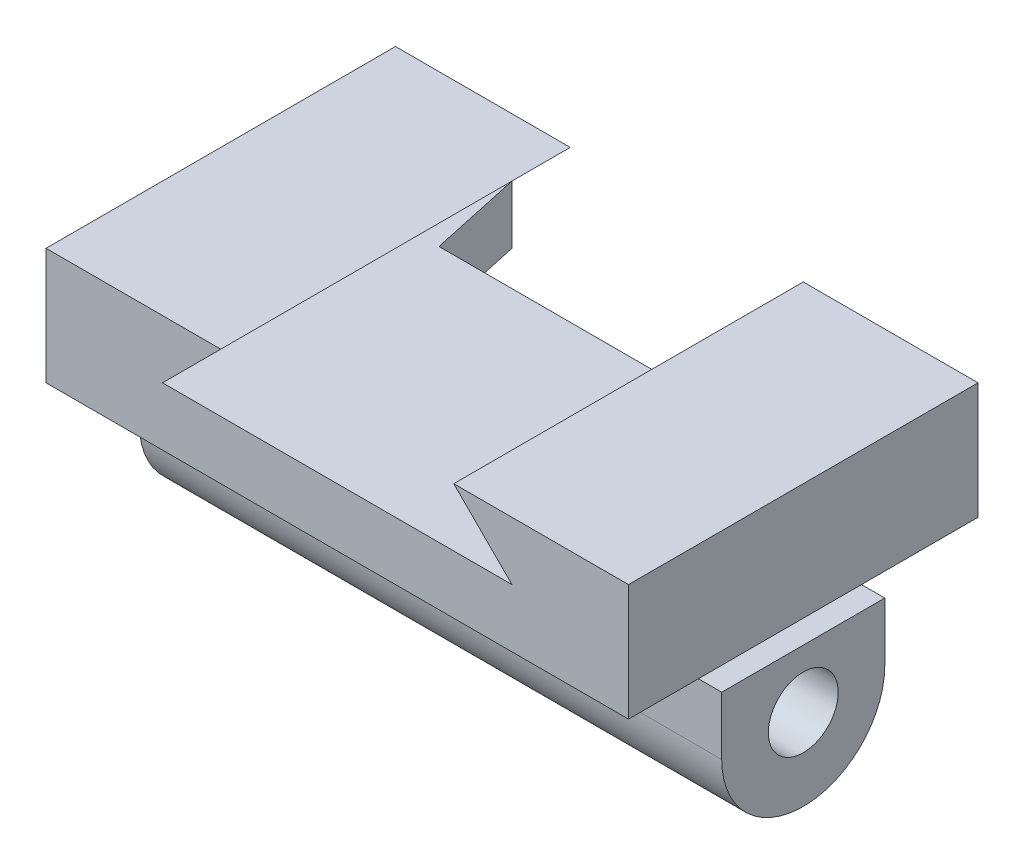
ISO-10303-21;
HEADER;
FILE_DESCRIPTION(('STEP AP214'),'2;1');
FILE_NAME('part.step','',(''),(''),'','','');
FILE_SCHEMA(('AUTOMOTIVE_DESIGN { 1 0 10303 214 1 1 1 1 }'));
ENDSEC;
DATA;
#1=APPLICATION_CONTEXT('core data for automotive mechanical design processes');
#2=APPLICATION_PROTOCOL_DEFINITION('international standard','automotive_design',2000,#1);
#3=PRODUCT_CONTEXT('',#1,'mechanical');
#4=PRODUCT('Part','Part','',(#3));
#5=PRODUCT_RELATED_PRODUCT_CATEGORY('part','',(#4));
#6=PRODUCT_DEFINITION_FORMATION('','',#4);
#7=PRODUCT_DEFINITION_CONTEXT('part definition',#1,'design');
#8=PRODUCT_DEFINITION('design','',#6,#7);
#9=PRODUCT_DEFINITION_SHAPE('','',#8);
#10=(LENGTH_UNIT() NAMED_UNIT(*) SI_UNIT(.MILLI.,.METRE.));
#11=(NAMED_UNIT(*) PLANE_ANGLE_UNIT() SI_UNIT($,.RADIAN.));
#12=(NAMED_UNIT(*) SI_UNIT($,.STERADIAN.) SOLID_ANGLE_UNIT());
#13=UNCERTAINTY_MEASURE_WITH_UNIT(LENGTH_MEASURE(1.E-05),#10,'distance_accuracy_value','');
#14=(GEOMETRIC_REPRESENTATION_CONTEXT(3) GLOBAL_UNCERTAINTY_ASSIGNED_CONTEXT((#13)) GLOBAL_UNIT_ASSIGNED_CONTEXT((#10,
#11,#12)) REPRESENTATION_CONTEXT('',''));
#15=CARTESIAN_POINT('',(0.,0.,0.));
#16=DIRECTION('',(0.,0.,1.));
#17=DIRECTION('',(1.,0.,0.));
#18=AXIS2_PLACEMENT_3D('',#15,#16,#17);
#19=CARTESIAN_POINT('',(0.,5.,0.));
#20=DIRECTION('',(0.,1.,0.));
#21=DIRECTION('',(0.,0.,1.));
#22=AXIS2_PLACEMENT_3D('',#19,#20,#21);
#23=PLANE('',#22);
#24=DIRECTION('',(1.,0.,0.));
#25=VECTOR('',#24,1.);
#26=CARTESIAN_POINT('',(0.,5.,15.));
#27=LINE('',#26,#25);
#28=CARTESIAN_POINT('',(-15.,5.,15.));
#29=VERTEX_POINT('',#28);
#30=CARTESIAN_POINT('',(15.,5.,15.));
#31=VERTEX_POINT('',#30);
#32=EDGE_CURVE('E53',#29,#31,#27,.T.);
#33=ORIENTED_EDGE('',*,*,#32,.T.);
#34=DIRECTION('',(0.,0.,1.));
#35=VECTOR('',#34,1.);
#36=CARTESIAN_POINT('',(15.,5.,-15.));
#37=LINE('',#36,#35);
#38=CARTESIAN_POINT('',(15.,5.,-15.));
#39=VERTEX_POINT('',#38);
#40=EDGE_CURVE('E222',#39,#31,#37,.T.);
#41=ORIENTED_EDGE('',*,*,#40,.F.);
#42=DIRECTION('',(-0.211772892657066,0.,0.977318904931066));
#43=VECTOR('',#42,1.);
#44=CARTESIAN_POINT('',(11.2227388558496,5.,2.4318284022202));
#45=LINE('',#44,#43);
#46=CARTESIAN_POINT('',(13.2664991614216,5.,-7.));
#47=VERTEX_POINT('',#46);
#48=EDGE_CURVE('E274',#39,#47,#45,.T.);
#49=ORIENTED_EDGE('',*,*,#48,.T.);
#50=DIRECTION('',(1.,0.,0.));
#51=VECTOR('',#50,1.);
#52=CARTESIAN_POINT('',(0.,5.,-7.));
#53=LINE('',#52,#51);
#54=CARTESIAN_POINT('',(-13.2664991614216,5.,-7.));
#55=VERTEX_POINT('',#54);
#56=EDGE_CURVE('E277',#55,#47,#53,.T.);
#57=ORIENTED_EDGE('',*,*,#56,.F.);
#58=DIRECTION('',(0.211772892657066,0.,0.977318904931066));
#59=VECTOR('',#58,1.);
#60=CARTESIAN_POINT('',(-11.2227388558496,5.,2.4318284022202));
#61=LINE('',#60,#59);
#62=CARTESIAN_POINT('',(-15.,5.,-15.));
#63=VERTEX_POINT('',#62);
#64=EDGE_CURVE('E280',#63,#55,#61,.T.);
#65=ORIENTED_EDGE('',*,*,#64,.F.);
#66=DIRECTION('',(0.,0.,1.));
#67=VECTOR('',#66,1.);
#68=CARTESIAN_POINT('',(-15.,5.,-15.));
#69=LINE('',#68,#67);
#70=EDGE_CURVE('E240',#63,#29,#69,.T.);
#71=ORIENTED_EDGE('',*,*,#70,.T.);
#72=EDGE_LOOP('',(#33,#41,#49,#57,#65,#71));
#73=FACE_BOUND('',#72,.T.);
#74=ADVANCED_FACE('F38',(#73),#23,.T.);
#75=CARTESIAN_POINT('',(0.,5.,15.));
#76=DIRECTION('',(0.,0.,-1.));
#77=DIRECTION('',(-1.,0.,0.));
#78=AXIS2_PLACEMENT_3D('',#75,#76,#77);
#79=PLANE('',#78);
#80=DIRECTION('',(1.,0.,0.));
#81=VECTOR('',#80,1.);
#82=CARTESIAN_POINT('',(0.,0.,15.));
#83=LINE('',#82,#81);
#84=CARTESIAN_POINT('',(-25.,0.,15.));
#85=VERTEX_POINT('',#84);
#86=CARTESIAN_POINT('',(25.,0.,15.));
#87=VERTEX_POINT('',#86);
#88=EDGE_CURVE('E272',#85,#87,#83,.T.);
#89=ORIENTED_EDGE('',*,*,#88,.T.);
#90=DIRECTION('',(0.,-1.,0.));
#91=VECTOR('',#90,1.);
#92=CARTESIAN_POINT('',(25.,5.,15.));
#93=LINE('',#92,#91);
#94=CARTESIAN_POINT('',(25.,10.,15.));
#95=VERTEX_POINT('',#94);
#96=EDGE_CURVE('E11',#95,#87,#93,.T.);
#97=ORIENTED_EDGE('',*,*,#96,.F.);
#98=DIRECTION('',(1.,0.,0.));
#99=VECTOR('',#98,1.);
#100=CARTESIAN_POINT('',(0.,10.,15.));
#101=LINE('',#100,#99);
#102=CARTESIAN_POINT('',(10.0000000000001,10.,15.));
#103=VERTEX_POINT('',#102);
#104=EDGE_CURVE('E219',#103,#95,#101,.T.);
#105=ORIENTED_EDGE('',*,*,#104,.F.);
#106=DIRECTION('',(-0.707106781186539,0.707106781186556,0.));
#107=VECTOR('',#106,1.);
#108=CARTESIAN_POINT('',(10.0000000000002,9.99999999999994,15.));
#109=LINE('',#108,#107);
#110=EDGE_CURVE('E208',#31,#103,#109,.T.);
#111=ORIENTED_EDGE('',*,*,#110,.F.);
#112=ORIENTED_EDGE('',*,*,#32,.F.);
#113=DIRECTION('',(0.707106781186539,0.707106781186556,0.));
#114=VECTOR('',#113,1.);
#115=CARTESIAN_POINT('',(-10.0000000000002,9.99999999999994,15.));
#116=LINE('',#115,#114);
#117=CARTESIAN_POINT('',(-10.0000000000001,10.,15.));
#118=VERTEX_POINT('',#117);
#119=EDGE_CURVE('E61',#29,#118,#116,.T.);
#120=ORIENTED_EDGE('',*,*,#119,.T.);
#121=DIRECTION('',(1.,0.,0.));
#122=VECTOR('',#121,1.);
#123=CARTESIAN_POINT('',(0.,10.,15.));
#124=LINE('',#123,#122);
#125=CARTESIAN_POINT('',(-25.,10.,15.));
#126=VERTEX_POINT('',#125);
#127=EDGE_CURVE('E238',#126,#118,#124,.T.);
#128=ORIENTED_EDGE('',*,*,#127,.F.);
#129=DIRECTION('',(0.,-1.,0.));
#130=VECTOR('',#129,1.);
#131=CARTESIAN_POINT('',(-25.,5.,15.));
#132=LINE('',#131,#130);
#133=EDGE_CURVE('E283',#126,#85,#132,.T.);
#134=ORIENTED_EDGE('',*,*,#133,.T.);
#135=EDGE_LOOP('',(#89,#97,#105,#111,#112,#120,#128,#134));
#136=FACE_BOUND('',#135,.T.);
#137=ADVANCED_FACE('F40',(#136),#79,.F.);
#138=CARTESIAN_POINT('',(25.,5.,0.));
#139=DIRECTION('',(1.,0.,0.));
#140=DIRECTION('',(0.,0.,-1.));
#141=AXIS2_PLACEMENT_3D('',#138,#139,#140);
#142=PLANE('',#141);
#143=DIRECTION('',(0.,0.,1.));
#144=VECTOR('',#143,1.);
#145=CARTESIAN_POINT('',(25.,0.,0.));
#146=LINE('',#145,#144);
#147=CARTESIAN_POINT('',(25.,0.,-15.));
#148=VERTEX_POINT('',#147);
#149=EDGE_CURVE('E286',#148,#87,#146,.T.);
#150=ORIENTED_EDGE('',*,*,#149,.F.);
#151=DIRECTION('',(0.,-1.,0.));
#152=VECTOR('',#151,1.);
#153=CARTESIAN_POINT('',(25.,5.,-15.));
#154=LINE('',#153,#152);
#155=CARTESIAN_POINT('',(25.,10.,-15.));
#156=VERTEX_POINT('',#155);
#157=EDGE_CURVE('E46',#156,#148,#154,.T.);
#158=ORIENTED_EDGE('',*,*,#157,.F.);
#159=DIRECTION('',(0.,0.,1.));
#160=VECTOR('',#159,1.);
#161=CARTESIAN_POINT('',(25.,10.,-15.));
#162=LINE('',#161,#160);
#163=EDGE_CURVE('E230',#156,#95,#162,.T.);
#164=ORIENTED_EDGE('',*,*,#163,.T.);
#165=ORIENTED_EDGE('',*,*,#96,.T.);
#166=EDGE_LOOP('',(#150,#158,#164,#165));
#167=FACE_BOUND('',#166,.T.);
#168=ADVANCED_FACE('F324',(#167),#142,.T.);
#169=CARTESIAN_POINT('',(0.,5.,-15.));
#170=DIRECTION('',(0.,0.,1.));
#171=DIRECTION('',(1.,0.,0.));
#172=AXIS2_PLACEMENT_3D('',#169,#170,#171);
#173=PLANE('',#172);
#174=DIRECTION('',(-1.,0.,0.));
#175=VECTOR('',#174,1.);
#176=CARTESIAN_POINT('',(0.,0.,-15.));
#177=LINE('',#176,#175);
#178=CARTESIAN_POINT('',(15.,0.,-15.));
#179=VERTEX_POINT('',#178);
#180=EDGE_CURVE('E289',#148,#179,#177,.T.);
#181=ORIENTED_EDGE('',*,*,#180,.T.);
#182=DIRECTION('',(0.,-1.,0.));
#183=VECTOR('',#182,1.);
#184=CARTESIAN_POINT('',(15.,5.,-15.));
#185=LINE('',#184,#183);
#186=EDGE_CURVE('E311',#39,#179,#185,.T.);
#187=ORIENTED_EDGE('',*,*,#186,.F.);
#188=DIRECTION('',(-0.707106781186539,0.707106781186556,0.));
#189=VECTOR('',#188,1.);
#190=CARTESIAN_POINT('',(10.0000000000002,9.99999999999994,-15.));
#191=LINE('',#190,#189);
#192=CARTESIAN_POINT('',(10.0000000000001,10.,-15.));
#193=VERTEX_POINT('',#192);
#194=EDGE_CURVE('E215',#39,#193,#191,.T.);
#195=ORIENTED_EDGE('',*,*,#194,.T.);
#196=DIRECTION('',(1.,0.,0.));
#197=VECTOR('',#196,1.);
#198=CARTESIAN_POINT('',(0.,10.,-15.));
#199=LINE('',#198,#197);
#200=EDGE_CURVE('E218',#193,#156,#199,.T.);
#201=ORIENTED_EDGE('',*,*,#200,.T.);
#202=ORIENTED_EDGE('',*,*,#157,.T.);
#203=EDGE_LOOP('',(#181,#187,#195,#201,#202));
#204=FACE_BOUND('',#203,.T.);
#205=ADVANCED_FACE('F315',(#204),#173,.F.);
#206=CARTESIAN_POINT('',(11.2227388558496,5.,2.4318284022202));
#207=DIRECTION('',(0.977318904931066,0.,0.211772892657066));
#208=DIRECTION('',(0.211772892657066,0.,-0.977318904931066));
#209=AXIS2_PLACEMENT_3D('',#206,#207,#208);
#210=PLANE('',#209);
#211=DIRECTION('',(-0.211772892657066,0.,0.977318904931066));
#212=VECTOR('',#211,1.);
#213=CARTESIAN_POINT('',(11.2227388558496,0.,2.4318284022202));
#214=LINE('',#213,#212);
#215=CARTESIAN_POINT('',(13.2664991614216,0.,-7.));
#216=VERTEX_POINT('',#215);
#217=EDGE_CURVE('E291',#179,#216,#214,.T.);
#218=ORIENTED_EDGE('',*,*,#217,.T.);
#219=DIRECTION('',(0.,-1.,0.));
#220=VECTOR('',#219,1.);
#221=CARTESIAN_POINT('',(13.2664991614216,5.,-7.));
#222=LINE('',#221,#220);
#223=EDGE_CURVE('E309',#47,#216,#222,.T.);
#224=ORIENTED_EDGE('',*,*,#223,.F.);
#225=ORIENTED_EDGE('',*,*,#48,.F.);
#226=ORIENTED_EDGE('',*,*,#186,.T.);
#227=EDGE_LOOP('',(#218,#224,#225,#226));
#228=FACE_BOUND('',#227,.T.);
#229=ADVANCED_FACE('F356',(#228),#210,.F.);
#230=CARTESIAN_POINT('',(0.,5.,-7.));
#231=DIRECTION('',(0.,0.,-1.));
#232=DIRECTION('',(-1.,0.,0.));
#233=AXIS2_PLACEMENT_3D('',#230,#231,#232);
#234=PLANE('',#233);
#235=ORIENTED_EDGE('',*,*,#223,.T.);
#236=DIRECTION('',(0.,1.,0.));
#237=VECTOR('',#236,1.);
#238=CARTESIAN_POINT('',(13.2664991614216,-2.,-7.));
#239=LINE('',#238,#237);
#240=CARTESIAN_POINT('',(13.2664991614216,-2.,-7.));
#241=VERTEX_POINT('',#240);
#242=EDGE_CURVE('E269',#241,#216,#239,.T.);
#243=ORIENTED_EDGE('',*,*,#242,.F.);
#244=DIRECTION('',(1.,0.,0.));
#245=VECTOR('',#244,1.);
#246=CARTESIAN_POINT('',(-25.,-2.,-6.99999999999999));
#247=LINE('',#246,#245);
#248=CARTESIAN_POINT('',(25.,-2.,-6.99999999999999));
#249=VERTEX_POINT('',#248);
#250=EDGE_CURVE('E175',#241,#249,#247,.T.);
#251=ORIENTED_EDGE('',*,*,#250,.T.);
#252=DIRECTION('',(0.,1.,0.));
#253=VECTOR('',#252,1.);
#254=CARTESIAN_POINT('',(25.,-2.,-6.99999999999999));
#255=LINE('',#254,#253);
#256=CARTESIAN_POINT('',(25.,-7.,-6.99999999999999));
#257=VERTEX_POINT('',#256);
#258=EDGE_CURVE('E170',#257,#249,#255,.T.);
#259=ORIENTED_EDGE('',*,*,#258,.F.);
#260=DIRECTION('',(1.,0.,0.));
#261=VECTOR('',#260,1.);
#262=CARTESIAN_POINT('',(-25.,-7.,-6.99999999999999));
#263=LINE('',#262,#261);
#264=CARTESIAN_POINT('',(-25.,-7.,-6.99999999999999));
#265=VERTEX_POINT('',#264);
#266=EDGE_CURVE('E163',#265,#257,#263,.T.);
#267=ORIENTED_EDGE('',*,*,#266,.F.);
#268=DIRECTION('',(0.,1.,0.));
#269=VECTOR('',#268,1.);
#270=CARTESIAN_POINT('',(-25.,-2.,-6.99999999999999));
#271=LINE('',#270,#269);
#272=CARTESIAN_POINT('',(-25.,-2.,-6.99999999999999));
#273=VERTEX_POINT('',#272);
#274=EDGE_CURVE('E168',#265,#273,#271,.T.);
#275=ORIENTED_EDGE('',*,*,#274,.T.);
#276=CARTESIAN_POINT('',(-13.2664991614216,-2.,-6.99999999999999));
#277=VERTEX_POINT('',#276);
#278=EDGE_CURVE('E213',#273,#277,#247,.T.);
#279=ORIENTED_EDGE('',*,*,#278,.T.);
#280=DIRECTION('',(0.,1.,0.));
#281=VECTOR('',#280,1.);
#282=CARTESIAN_POINT('',(-13.2664991614216,-2.,-7.));
#283=LINE('',#282,#281);
#284=CARTESIAN_POINT('',(-13.2664991614216,0.,-7.));
#285=VERTEX_POINT('',#284);
#286=EDGE_CURVE('E260',#277,#285,#283,.T.);
#287=ORIENTED_EDGE('',*,*,#286,.T.);
#288=DIRECTION('',(0.,-1.,0.));
#289=VECTOR('',#288,1.);
#290=CARTESIAN_POINT('',(-13.2664991614216,5.,-7.));
#291=LINE('',#290,#289);
#292=EDGE_CURVE('E307',#55,#285,#291,.T.);
#293=ORIENTED_EDGE('',*,*,#292,.F.);
#294=ORIENTED_EDGE('',*,*,#56,.T.);
#295=EDGE_LOOP('',(#235,#243,#251,#259,#267,#275,#279,#287,#293,#294));
#296=FACE_BOUND('',#295,.T.);
#297=ADVANCED_FACE('F166',(#296),#234,.T.);
#298=CARTESIAN_POINT('',(-11.2227388558496,5.,2.4318284022202));
#299=DIRECTION('',(0.977318904931066,0.,-0.211772892657066));
#300=DIRECTION('',(-0.211772892657066,0.,-0.977318904931066));
#301=AXIS2_PLACEMENT_3D('',#298,#299,#300);
#302=PLANE('',#301);
#303=DIRECTION('',(0.211772892657066,0.,0.977318904931066));
#304=VECTOR('',#303,1.);
#305=CARTESIAN_POINT('',(-11.2227388558496,0.,2.4318284022202));
#306=LINE('',#305,#304);
#307=CARTESIAN_POINT('',(-15.,0.,-15.));
#308=VERTEX_POINT('',#307);
#309=EDGE_CURVE('E294',#308,#285,#306,.T.);
#310=ORIENTED_EDGE('',*,*,#309,.F.);
#311=DIRECTION('',(0.,-1.,0.));
#312=VECTOR('',#311,1.);
#313=CARTESIAN_POINT('',(-15.,5.,-15.));
#314=LINE('',#313,#312);
#315=EDGE_CURVE('E305',#63,#308,#314,.T.);
#316=ORIENTED_EDGE('',*,*,#315,.F.);
#317=ORIENTED_EDGE('',*,*,#64,.T.);
#318=ORIENTED_EDGE('',*,*,#292,.T.);
#319=EDGE_LOOP('',(#310,#316,#317,#318));
#320=FACE_BOUND('',#319,.T.);
#321=ADVANCED_FACE('F338',(#320),#302,.T.);
#322=CARTESIAN_POINT('',(0.,5.,-15.));
#323=DIRECTION('',(0.,0.,-1.));
#324=DIRECTION('',(-1.,0.,0.));
#325=AXIS2_PLACEMENT_3D('',#322,#323,#324);
#326=PLANE('',#325);
#327=DIRECTION('',(1.,0.,0.));
#328=VECTOR('',#327,1.);
#329=CARTESIAN_POINT('',(0.,0.,-15.));
#330=LINE('',#329,#328);
#331=CARTESIAN_POINT('',(-25.,0.,-15.));
#332=VERTEX_POINT('',#331);
#333=EDGE_CURVE('E297',#332,#308,#330,.T.);
#334=ORIENTED_EDGE('',*,*,#333,.F.);
#335=DIRECTION('',(0.,-1.,0.));
#336=VECTOR('',#335,1.);
#337=CARTESIAN_POINT('',(-25.,5.,-15.));
#338=LINE('',#337,#336);
#339=CARTESIAN_POINT('',(-25.,10.,-15.));
#340=VERTEX_POINT('',#339);
#341=EDGE_CURVE('E303',#340,#332,#338,.T.);
#342=ORIENTED_EDGE('',*,*,#341,.F.);
#343=DIRECTION('',(1.,0.,0.));
#344=VECTOR('',#343,1.);
#345=CARTESIAN_POINT('',(0.,10.,-15.));
#346=LINE('',#345,#344);
#347=CARTESIAN_POINT('',(-10.0000000000001,10.,-15.));
#348=VERTEX_POINT('',#347);
#349=EDGE_CURVE('E237',#340,#348,#346,.T.);
#350=ORIENTED_EDGE('',*,*,#349,.T.);
#351=DIRECTION('',(0.707106781186539,0.707106781186556,0.));
#352=VECTOR('',#351,1.);
#353=CARTESIAN_POINT('',(-10.0000000000002,9.99999999999994,-15.));
#354=LINE('',#353,#352);
#355=EDGE_CURVE('E234',#63,#348,#354,.T.);
#356=ORIENTED_EDGE('',*,*,#355,.F.);
#357=ORIENTED_EDGE('',*,*,#315,.T.);
#358=EDGE_LOOP('',(#334,#342,#350,#356,#357));
#359=FACE_BOUND('',#358,.T.);
#360=ADVANCED_FACE('F331',(#359),#326,.T.);
#361=CARTESIAN_POINT('',(-25.,5.,0.));
#362=DIRECTION('',(1.,0.,0.));
#363=DIRECTION('',(0.,0.,-1.));
#364=AXIS2_PLACEMENT_3D('',#361,#362,#363);
#365=PLANE('',#364);
#366=DIRECTION('',(0.,0.,1.));
#367=VECTOR('',#366,1.);
#368=CARTESIAN_POINT('',(-25.,0.,0.));
#369=LINE('',#368,#367);
#370=EDGE_CURVE('E275',#332,#85,#369,.T.);
#371=ORIENTED_EDGE('',*,*,#370,.T.);
#372=ORIENTED_EDGE('',*,*,#133,.F.);
#373=DIRECTION('',(0.,0.,1.));
#374=VECTOR('',#373,1.);
#375=CARTESIAN_POINT('',(-25.,10.,-15.));
#376=LINE('',#375,#374);
#377=EDGE_CURVE('E244',#340,#126,#376,.T.);
#378=ORIENTED_EDGE('',*,*,#377,.F.);
#379=ORIENTED_EDGE('',*,*,#341,.T.);
#380=EDGE_LOOP('',(#371,#372,#378,#379));
#381=FACE_BOUND('',#380,.T.);
#382=ADVANCED_FACE('F388',(#381),#365,.F.);
#383=CARTESIAN_POINT('',(0.,0.,0.));
#384=DIRECTION('',(0.,1.,0.));
#385=DIRECTION('',(0.,0.,1.));
#386=AXIS2_PLACEMENT_3D('',#383,#384,#385);
#387=PLANE('',#386);
#388=CARTESIAN_POINT('',(0.,0.,0.));
#389=DIRECTION('',(0.,-1.,0.));
#390=DIRECTION('',(0.,0.,-1.));
#391=AXIS2_PLACEMENT_3D('',#388,#389,#390);
#392=CIRCLE('',#391,15.);
#393=CARTESIAN_POINT('',(-13.2664991614216,0.,7.));
#394=VERTEX_POINT('',#393);
#395=EDGE_CURVE('E255',#394,#285,#392,.T.);
#396=ORIENTED_EDGE('',*,*,#395,.F.);
#397=DIRECTION('',(1.,0.,0.));
#398=VECTOR('',#397,1.);
#399=CARTESIAN_POINT('',(0.,0.,7.));
#400=LINE('',#399,#398);
#401=CARTESIAN_POINT('',(13.2664991614216,0.,7.));
#402=VERTEX_POINT('',#401);
#403=EDGE_CURVE('E258',#394,#402,#400,.T.);
#404=ORIENTED_EDGE('',*,*,#403,.T.);
#405=EDGE_CURVE('E247',#216,#402,#392,.T.);
#406=ORIENTED_EDGE('',*,*,#405,.F.);
#407=ORIENTED_EDGE('',*,*,#217,.F.);
#408=ORIENTED_EDGE('',*,*,#180,.F.);
#409=ORIENTED_EDGE('',*,*,#149,.T.);
#410=ORIENTED_EDGE('',*,*,#88,.F.);
#411=ORIENTED_EDGE('',*,*,#370,.F.);
#412=ORIENTED_EDGE('',*,*,#333,.T.);
#413=ORIENTED_EDGE('',*,*,#309,.T.);
#414=EDGE_LOOP('',(#396,#404,#406,#407,#408,#409,#410,#411,#412,#413));
#415=FACE_BOUND('',#414,.T.);
#416=ADVANCED_FACE('F322',(#415),#387,.F.);
#417=CARTESIAN_POINT('',(0.,-2.,0.));
#418=DIRECTION('',(0.,1.,0.));
#419=DIRECTION('',(0.,0.,1.));
#420=AXIS2_PLACEMENT_3D('',#417,#418,#419);
#421=CYLINDRICAL_SURFACE('',#420,15.);
#422=ORIENTED_EDGE('',*,*,#405,.T.);
#423=DIRECTION('',(0.,1.,0.));
#424=VECTOR('',#423,1.);
#425=CARTESIAN_POINT('',(13.2664991614216,-2.,7.));
#426=LINE('',#425,#424);
#427=CARTESIAN_POINT('',(13.2664991614216,-2.,7.));
#428=VERTEX_POINT('',#427);
#429=EDGE_CURVE('E266',#428,#402,#426,.T.);
#430=ORIENTED_EDGE('',*,*,#429,.F.);
#431=CARTESIAN_POINT('',(0.,-2.,0.));
#432=DIRECTION('',(0.,-1.,0.));
#433=DIRECTION('',(0.,0.,-1.));
#434=AXIS2_PLACEMENT_3D('',#431,#432,#433);
#435=CIRCLE('',#434,15.);
#436=EDGE_CURVE('E251',#241,#428,#435,.T.);
#437=ORIENTED_EDGE('',*,*,#436,.F.);
#438=ORIENTED_EDGE('',*,*,#242,.T.);
#439=EDGE_LOOP('',(#422,#430,#437,#438));
#440=FACE_BOUND('',#439,.T.);
#441=ADVANCED_FACE('F357',(#440),#421,.T.);
#442=CARTESIAN_POINT('',(0.,-2.,7.));
#443=DIRECTION('',(0.,0.,1.));
#444=DIRECTION('',(1.,0.,0.));
#445=AXIS2_PLACEMENT_3D('',#442,#443,#444);
#446=PLANE('',#445);
#447=ORIENTED_EDGE('',*,*,#403,.F.);
#448=DIRECTION('',(0.,1.,0.));
#449=VECTOR('',#448,1.);
#450=CARTESIAN_POINT('',(-13.2664991614216,-2.,7.));
#451=LINE('',#450,#449);
#452=CARTESIAN_POINT('',(-13.2664991614216,-2.,7.));
#453=VERTEX_POINT('',#452);
#454=EDGE_CURVE('E263',#453,#394,#451,.T.);
#455=ORIENTED_EDGE('',*,*,#454,.F.);
#456=DIRECTION('',(1.,0.,0.));
#457=VECTOR('',#456,1.);
#458=CARTESIAN_POINT('',(-25.,-2.,7.00000000000001));
#459=LINE('',#458,#457);
#460=CARTESIAN_POINT('',(-25.,-2.,7.00000000000001));
#461=VERTEX_POINT('',#460);
#462=EDGE_CURVE('E209',#461,#453,#459,.T.);
#463=ORIENTED_EDGE('',*,*,#462,.F.);
#464=DIRECTION('',(0.,-1.,0.));
#465=VECTOR('',#464,1.);
#466=CARTESIAN_POINT('',(-25.,-7.,7.00000000000001));
#467=LINE('',#466,#465);
#468=CARTESIAN_POINT('',(-25.,-7.,7.00000000000001));
#469=VERTEX_POINT('',#468);
#470=EDGE_CURVE('E176',#461,#469,#467,.T.);
#471=ORIENTED_EDGE('',*,*,#470,.T.);
#472=DIRECTION('',(1.,0.,0.));
#473=VECTOR('',#472,1.);
#474=CARTESIAN_POINT('',(-25.,-7.,7.00000000000001));
#475=LINE('',#474,#473);
#476=CARTESIAN_POINT('',(25.,-7.,7.00000000000001));
#477=VERTEX_POINT('',#476);
#478=EDGE_CURVE('E189',#469,#477,#475,.T.);
#479=ORIENTED_EDGE('',*,*,#478,.T.);
#480=DIRECTION('',(0.,-1.,0.));
#481=VECTOR('',#480,1.);
#482=CARTESIAN_POINT('',(25.,-7.,7.00000000000001));
#483=LINE('',#482,#481);
#484=CARTESIAN_POINT('',(25.,-2.,7.00000000000001));
#485=VERTEX_POINT('',#484);
#486=EDGE_CURVE('E190',#485,#477,#483,.T.);
#487=ORIENTED_EDGE('',*,*,#486,.F.);
#488=EDGE_CURVE('E212',#428,#485,#459,.T.);
#489=ORIENTED_EDGE('',*,*,#488,.F.);
#490=ORIENTED_EDGE('',*,*,#429,.T.);
#491=EDGE_LOOP('',(#447,#455,#463,#471,#479,#487,#489,#490));
#492=FACE_BOUND('',#491,.T.);
#493=ADVANCED_FACE('F349',(#492),#446,.T.);
#494=ORIENTED_EDGE('',*,*,#395,.T.);
#495=ORIENTED_EDGE('',*,*,#286,.F.);
#496=EDGE_CURVE('E254',#453,#277,#435,.T.);
#497=ORIENTED_EDGE('',*,*,#496,.F.);
#498=ORIENTED_EDGE('',*,*,#454,.T.);
#499=EDGE_LOOP('',(#494,#495,#497,#498));
#500=FACE_BOUND('',#499,.T.);
#501=ADVANCED_FACE('F341',(#500),#421,.T.);
#502=CARTESIAN_POINT('',(0.,10.,-15.));
#503=DIRECTION('',(0.,-1.,0.));
#504=DIRECTION('',(0.,0.,-1.));
#505=AXIS2_PLACEMENT_3D('',#502,#503,#504);
#506=PLANE('',#505);
#507=ORIENTED_EDGE('',*,*,#127,.T.);
#508=DIRECTION('',(0.,0.,1.));
#509=VECTOR('',#508,1.);
#510=CARTESIAN_POINT('',(-10.0000000000001,10.,-15.));
#511=LINE('',#510,#509);
#512=EDGE_CURVE('E248',#348,#118,#511,.T.);
#513=ORIENTED_EDGE('',*,*,#512,.F.);
#514=ORIENTED_EDGE('',*,*,#349,.F.);
#515=ORIENTED_EDGE('',*,*,#377,.T.);
#516=EDGE_LOOP('',(#507,#513,#514,#515));
#517=FACE_BOUND('',#516,.T.);
#518=ADVANCED_FACE('F451',(#517),#506,.F.);
#519=CARTESIAN_POINT('',(-10.0000000000002,9.99999999999994,-15.));
#520=DIRECTION('',(0.707106781186556,-0.707106781186539,0.));
#521=DIRECTION('',(0.707106781186539,0.707106781186556,0.));
#522=AXIS2_PLACEMENT_3D('',#519,#520,#521);
#523=PLANE('',#522);
#524=ORIENTED_EDGE('',*,*,#119,.F.);
#525=ORIENTED_EDGE('',*,*,#70,.F.);
#526=ORIENTED_EDGE('',*,*,#355,.T.);
#527=ORIENTED_EDGE('',*,*,#512,.T.);
#528=EDGE_LOOP('',(#524,#525,#526,#527));
#529=FACE_BOUND('',#528,.T.);
#530=ADVANCED_FACE('F457',(#529),#523,.T.);
#531=CARTESIAN_POINT('',(10.0000000000002,9.99999999999994,-15.));
#532=DIRECTION('',(0.707106781186556,0.707106781186539,0.));
#533=DIRECTION('',(-0.707106781186539,0.707106781186556,0.));
#534=AXIS2_PLACEMENT_3D('',#531,#532,#533);
#535=PLANE('',#534);
#536=ORIENTED_EDGE('',*,*,#110,.T.);
#537=DIRECTION('',(0.,0.,1.));
#538=VECTOR('',#537,1.);
#539=CARTESIAN_POINT('',(10.0000000000001,10.,-15.));
#540=LINE('',#539,#538);
#541=EDGE_CURVE('E227',#193,#103,#540,.T.);
#542=ORIENTED_EDGE('',*,*,#541,.F.);
#543=ORIENTED_EDGE('',*,*,#194,.F.);
#544=ORIENTED_EDGE('',*,*,#40,.T.);
#545=EDGE_LOOP('',(#536,#542,#543,#544));
#546=FACE_BOUND('',#545,.T.);
#547=ADVANCED_FACE('F465',(#546),#535,.F.);
#548=CARTESIAN_POINT('',(0.,10.,-15.));
#549=DIRECTION('',(0.,-1.,0.));
#550=DIRECTION('',(0.,0.,-1.));
#551=AXIS2_PLACEMENT_3D('',#548,#549,#550);
#552=PLANE('',#551);
#553=ORIENTED_EDGE('',*,*,#104,.T.);
#554=ORIENTED_EDGE('',*,*,#163,.F.);
#555=ORIENTED_EDGE('',*,*,#200,.F.);
#556=ORIENTED_EDGE('',*,*,#541,.T.);
#557=EDGE_LOOP('',(#553,#554,#555,#556));
#558=FACE_BOUND('',#557,.T.);
#559=ADVANCED_FACE('F472',(#558),#552,.F.);
#560=CARTESIAN_POINT('',(-25.,-2.,7.00000000000001));
#561=DIRECTION('',(0.,1.,0.));
#562=DIRECTION('',(0.,0.,1.));
#563=AXIS2_PLACEMENT_3D('',#560,#561,#562);
#564=PLANE('',#563);
#565=ORIENTED_EDGE('',*,*,#250,.F.);
#566=ORIENTED_EDGE('',*,*,#436,.T.);
#567=ORIENTED_EDGE('',*,*,#488,.T.);
#568=DIRECTION('',(0.,0.,1.));
#569=VECTOR('',#568,1.);
#570=CARTESIAN_POINT('',(25.,-2.,7.00000000000001));
#571=LINE('',#570,#569);
#572=EDGE_CURVE('E193',#249,#485,#571,.T.);
#573=ORIENTED_EDGE('',*,*,#572,.F.);
#574=EDGE_LOOP('',(#565,#566,#567,#573));
#575=FACE_BOUND('',#574,.T.);
#576=ADVANCED_FACE('F359',(#575),#564,.T.);
#577=CARTESIAN_POINT('',(-25.,-7.,0.));
#578=DIRECTION('',(1.,0.,0.));
#579=DIRECTION('',(0.,0.,-1.));
#580=AXIS2_PLACEMENT_3D('',#577,#578,#579);
#581=CYLINDRICAL_SURFACE('',#580,7.);
#582=CARTESIAN_POINT('',(25.,-7.,0.));
#583=DIRECTION('',(1.,0.,0.));
#584=DIRECTION('',(0.,0.,-1.));
#585=AXIS2_PLACEMENT_3D('',#582,#583,#584);
#586=CIRCLE('',#585,7.);
#587=EDGE_CURVE('E201',#477,#257,#586,.T.);
#588=ORIENTED_EDGE('',*,*,#587,.F.);
#589=ORIENTED_EDGE('',*,*,#478,.F.);
#590=CARTESIAN_POINT('',(-25.,-7.,0.));
#591=DIRECTION('',(1.,0.,0.));
#592=DIRECTION('',(0.,0.,-1.));
#593=AXIS2_PLACEMENT_3D('',#590,#591,#592);
#594=CIRCLE('',#593,7.);
#595=EDGE_CURVE('E183',#469,#265,#594,.T.);
#596=ORIENTED_EDGE('',*,*,#595,.T.);
#597=ORIENTED_EDGE('',*,*,#266,.T.);
#598=EDGE_LOOP('',(#588,#589,#596,#597));
#599=FACE_BOUND('',#598,.T.);
#600=ADVANCED_FACE('F188',(#599),#581,.T.);
#601=ORIENTED_EDGE('',*,*,#462,.T.);
#602=ORIENTED_EDGE('',*,*,#496,.T.);
#603=ORIENTED_EDGE('',*,*,#278,.F.);
#604=DIRECTION('',(0.,0.,1.));
#605=VECTOR('',#604,1.);
#606=CARTESIAN_POINT('',(-25.,-2.,7.00000000000001));
#607=LINE('',#606,#605);
#608=EDGE_CURVE('E186',#273,#461,#607,.T.);
#609=ORIENTED_EDGE('',*,*,#608,.T.);
#610=EDGE_LOOP('',(#601,#602,#603,#609));
#611=FACE_BOUND('',#610,.T.);
#612=ADVANCED_FACE('F347',(#611),#564,.T.);
#613=CARTESIAN_POINT('',(-25.,-7.,0.));
#614=DIRECTION('',(1.,0.,0.));
#615=DIRECTION('',(0.,0.,-1.));
#616=AXIS2_PLACEMENT_3D('',#613,#614,#615);
#617=PLANE('',#616);
#618=CARTESIAN_POINT('',(-25.,-7.,0.));
#619=DIRECTION('',(1.,0.,0.));
#620=DIRECTION('',(0.,0.,-1.));
#621=AXIS2_PLACEMENT_3D('',#618,#619,#620);
#622=CIRCLE('',#621,3.);
#623=CARTESIAN_POINT('',(-25.,-7.,-2.99999999999999));
#624=VERTEX_POINT('',#623);
#625=EDGE_CURVE('E203',#624,#624,#622,.T.);
#626=ORIENTED_EDGE('',*,*,#625,.T.);
#627=EDGE_LOOP('',(#626));
#628=FACE_BOUND('',#627,.T.);
#629=ORIENTED_EDGE('',*,*,#595,.F.);
#630=ORIENTED_EDGE('',*,*,#470,.F.);
#631=ORIENTED_EDGE('',*,*,#608,.F.);
#632=ORIENTED_EDGE('',*,*,#274,.F.);
#633=EDGE_LOOP('',(#629,#630,#631,#632));
#634=FACE_BOUND('',#633,.T.);
#635=ADVANCED_FACE('F181',(#628,#634),#617,.F.);
#636=CARTESIAN_POINT('',(25.,-7.,0.));
#637=DIRECTION('',(1.,0.,0.));
#638=DIRECTION('',(0.,0.,-1.));
#639=AXIS2_PLACEMENT_3D('',#636,#637,#638);
#640=PLANE('',#639);
#641=CARTESIAN_POINT('',(25.,-7.,0.));
#642=DIRECTION('',(1.,0.,0.));
#643=DIRECTION('',(0.,0.,-1.));
#644=AXIS2_PLACEMENT_3D('',#641,#642,#643);
#645=CIRCLE('',#644,3.);
#646=CARTESIAN_POINT('',(25.,-7.,-2.99999999999999));
#647=VERTEX_POINT('',#646);
#648=EDGE_CURVE('E196',#647,#647,#645,.T.);
#649=ORIENTED_EDGE('',*,*,#648,.F.);
#650=EDGE_LOOP('',(#649));
#651=FACE_BOUND('',#650,.T.);
#652=ORIENTED_EDGE('',*,*,#587,.T.);
#653=ORIENTED_EDGE('',*,*,#258,.T.);
#654=ORIENTED_EDGE('',*,*,#572,.T.);
#655=ORIENTED_EDGE('',*,*,#486,.T.);
#656=EDGE_LOOP('',(#652,#653,#654,#655));
#657=FACE_BOUND('',#656,.T.);
#658=ADVANCED_FACE('F363',(#651,#657),#640,.T.);
#659=CARTESIAN_POINT('',(-25.,-7.,0.));
#660=DIRECTION('',(1.,0.,0.));
#661=DIRECTION('',(0.,0.,-1.));
#662=AXIS2_PLACEMENT_3D('',#659,#660,#661);
#663=CYLINDRICAL_SURFACE('',#662,3.);
#664=ORIENTED_EDGE('',*,*,#625,.F.);
#665=EDGE_LOOP('',(#664));
#666=FACE_BOUND('',#665,.T.);
#667=ORIENTED_EDGE('',*,*,#648,.T.);
#668=EDGE_LOOP('',(#667));
#669=FACE_BOUND('',#668,.T.);
#670=ADVANCED_FACE('F365',(#666,#669),#663,.F.);
#671=CLOSED_SHELL('',(#74,#137,#168,#205,#229,#297,#321,#360,#382,#416,#441,#493,#501,#518,#530,
#547,#559,#576,#600,#612,#635,#658,#670));
#672=MANIFOLD_SOLID_BREP('B2',#671);
#673=ADVANCED_BREP_SHAPE_REPRESENTATION('',(#18,#672),#14);
#674=SHAPE_DEFINITION_REPRESENTATION(#9,#673);
ENDSEC;
END-ISO-10303-21;
